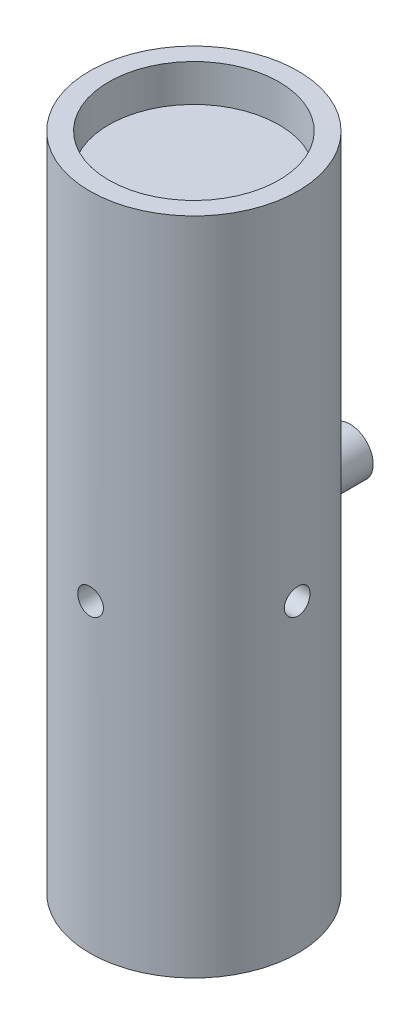
ISO-10303-21;
HEADER;
FILE_DESCRIPTION(('STEP AP214'),'2;1');
FILE_NAME('part.step','',(''),(''),'','','');
FILE_SCHEMA(('AUTOMOTIVE_DESIGN { 1 0 10303 214 1 1 1 1 }'));
ENDSEC;
DATA;
#1=APPLICATION_CONTEXT('core data for automotive mechanical design processes');
#2=APPLICATION_PROTOCOL_DEFINITION('international standard','automotive_design',2000,#1);
#3=PRODUCT_CONTEXT('',#1,'mechanical');
#4=PRODUCT('Part','Part','',(#3));
#5=PRODUCT_RELATED_PRODUCT_CATEGORY('part','',(#4));
#6=PRODUCT_DEFINITION_FORMATION('','',#4);
#7=PRODUCT_DEFINITION_CONTEXT('part definition',#1,'design');
#8=PRODUCT_DEFINITION('design','',#6,#7);
#9=PRODUCT_DEFINITION_SHAPE('','',#8);
#10=(LENGTH_UNIT() NAMED_UNIT(*) SI_UNIT(.MILLI.,.METRE.));
#11=(NAMED_UNIT(*) PLANE_ANGLE_UNIT() SI_UNIT($,.RADIAN.));
#12=(NAMED_UNIT(*) SI_UNIT($,.STERADIAN.) SOLID_ANGLE_UNIT());
#13=UNCERTAINTY_MEASURE_WITH_UNIT(LENGTH_MEASURE(1.E-05),#10,'distance_accuracy_value','');
#14=(GEOMETRIC_REPRESENTATION_CONTEXT(3) GLOBAL_UNCERTAINTY_ASSIGNED_CONTEXT((#13)) GLOBAL_UNIT_ASSIGNED_CONTEXT((#10,
#11,#12)) REPRESENTATION_CONTEXT('',''));
#15=CARTESIAN_POINT('',(0.,0.,0.));
#16=DIRECTION('',(0.,0.,1.));
#17=DIRECTION('',(1.,0.,0.));
#18=AXIS2_PLACEMENT_3D('',#15,#16,#17);
#19=CARTESIAN_POINT('',(0.,88.76,0.));
#20=DIRECTION('',(0.,-1.,0.));
#21=DIRECTION('',(0.,0.,-1.));
#22=AXIS2_PLACEMENT_3D('',#19,#20,#21);
#23=CYLINDRICAL_SURFACE('',#22,14.);
#24=CARTESIAN_POINT('',(0.,44.1186082579004,-14.));
#25=CARTESIAN_POINT('',(-0.17288559873218,44.1186024673412,-13.9999968247506));
#26=CARTESIAN_POINT('',(-0.345840479417576,44.1041834067007,-13.9967650947673));
#27=CARTESIAN_POINT('',(-0.686832100892802,44.0469512248152,-13.9841853435475));
#28=CARTESIAN_POINT('',(-0.854865330938911,44.00411832664,-13.9748330622746));
#29=CARTESIAN_POINT('',(-1.18103680616268,43.8914709054551,-13.9510528232426));
#30=CARTESIAN_POINT('',(-1.33918537166739,43.8216850891238,-13.9366302671309));
#31=CARTESIAN_POINT('',(-1.64152455498517,43.6572051450233,-13.9042635463428));
#32=CARTESIAN_POINT('',(-1.78571542977247,43.5625114759505,-13.8863194465198));
#33=CARTESIAN_POINT('',(-2.05844551454854,43.3492400436006,-13.8485400545193));
#34=CARTESIAN_POINT('',(-2.1867197668435,43.2303277089666,-13.8286805852968));
#35=CARTESIAN_POINT('',(-2.42167726702624,42.9727124578508,-13.7894778760588));
#36=CARTESIAN_POINT('',(-2.52835853214359,42.8340077259292,-13.7701346835918));
#37=CARTESIAN_POINT('',(-2.71828012896653,42.5387739892548,-13.7339156497362));
#38=CARTESIAN_POINT('',(-2.80123665011034,42.3820582749069,-13.7170707557811));
#39=CARTESIAN_POINT('',(-2.93953287428987,42.0564730730984,-13.6881033051187));
#40=CARTESIAN_POINT('',(-2.99487601179261,41.887605100089,-13.6759801611759));
#41=CARTESIAN_POINT('',(-3.07549535815312,41.5453880859891,-13.6580753617231));
#42=CARTESIAN_POINT('',(-3.10124159821529,41.3721550672849,-13.6521946877488));
#43=CARTESIAN_POINT('',(-3.12339813959293,41.0237363338195,-13.6471434018822));
#44=CARTESIAN_POINT('',(-3.11981218597547,40.848550871194,-13.6479719333736));
#45=CARTESIAN_POINT('',(-3.08378398910555,40.504707314814,-13.6561558737748));
#46=CARTESIAN_POINT('',(-3.05188944617238,40.3359884353907,-13.6633873945013));
#47=CARTESIAN_POINT('',(-2.96101789019469,40.0063580333015,-13.6833664424506));
#48=CARTESIAN_POINT('',(-2.90203930713653,39.8454469638384,-13.6961142894426));
#49=CARTESIAN_POINT('',(-2.75817542249511,39.5344688561734,-13.725810681509));
#50=CARTESIAN_POINT('',(-2.67308097729531,39.3845019233446,-13.7427929230549));
#51=CARTESIAN_POINT('',(-2.4795478405837,39.1007738865381,-13.7790241730297));
#52=CARTESIAN_POINT('',(-2.37110585516413,38.967015073393,-13.7982735011289));
#53=CARTESIAN_POINT('',(-2.13106422598798,38.7163486135509,-13.8374003707265));
#54=CARTESIAN_POINT('',(-1.99899926662553,38.599886791815,-13.8572823128574));
#55=CARTESIAN_POINT('',(-1.71698599477565,38.3906897481412,-13.8950410771421));
#56=CARTESIAN_POINT('',(-1.5670373346138,38.297954987588,-13.9129178603008));
#57=CARTESIAN_POINT('',(-1.2529578336961,38.1387279041848,-13.9447135400002));
#58=CARTESIAN_POINT('',(-1.08879553766422,38.0722956974523,-13.9586233497307));
#59=CARTESIAN_POINT('',(-0.751258802252493,37.9680843570755,-13.9808505186551));
#60=CARTESIAN_POINT('',(-0.577885757694159,37.9303008981934,-13.9891687220189));
#61=CARTESIAN_POINT('',(-0.230671562074419,37.8851119665634,-13.9991547012776));
#62=CARTESIAN_POINT('',(-0.0569133651427911,37.8770977319561,-14.0009557292084));
#63=CARTESIAN_POINT('',(0.289459185599277,37.8900223312151,-13.9980785834611));
#64=CARTESIAN_POINT('',(0.462073619172824,37.9109591242973,-13.9934008664756));
#65=CARTESIAN_POINT('',(0.799229731055024,37.9806869676355,-13.978176083199));
#66=CARTESIAN_POINT('',(0.963841093922699,38.0291571544068,-13.9676966628098));
#67=CARTESIAN_POINT('',(1.28259619913986,38.1522184931753,-13.9420421302591));
#68=CARTESIAN_POINT('',(1.4367390258074,38.2268119266663,-13.9268666079734));
#69=CARTESIAN_POINT('',(1.73268724707733,38.4012598069373,-13.893175494117));
#70=CARTESIAN_POINT('',(1.87427769086642,38.5014698570404,-13.8746140344689));
#71=CARTESIAN_POINT('',(2.13885105141606,38.7238398320689,-13.836300741361));
#72=CARTESIAN_POINT('',(2.26183145112206,38.8460027212911,-13.8165487473829));
#73=CARTESIAN_POINT('',(2.48811324521392,39.1116086297432,-13.777617869484));
#74=CARTESIAN_POINT('',(2.59099235322009,39.255414590721,-13.7584572223187));
#75=CARTESIAN_POINT('',(2.77114279726259,39.558619858086,-13.7233095812992));
#76=CARTESIAN_POINT('',(2.84841525384738,39.7180184817421,-13.7073224485841));
#77=CARTESIAN_POINT('',(2.97462785829789,40.0470229324819,-13.6804881379722));
#78=CARTESIAN_POINT('',(3.02372934654999,40.216564365883,-13.669611756132));
#79=CARTESIAN_POINT('',(3.09267431116263,40.5617662170522,-13.6541801894995));
#80=CARTESIAN_POINT('',(3.11252266743898,40.7374256092358,-13.6496239504083));
#81=CARTESIAN_POINT('',(3.12218428843875,41.0856148199428,-13.6474167219632));
#82=CARTESIAN_POINT('',(3.11266769128317,41.2581254017889,-13.6496116601893));
#83=CARTESIAN_POINT('',(3.06537202884534,41.5990181576787,-13.6603100772083));
#84=CARTESIAN_POINT('',(3.02759332261919,41.767400384143,-13.6688134758552));
#85=CARTESIAN_POINT('',(2.92517500962827,42.0947004213257,-13.6910942253496));
#86=CARTESIAN_POINT('',(2.86063638217311,42.2536512710079,-13.7048517344222));
#87=CARTESIAN_POINT('',(2.70661573281935,42.5585673824521,-13.7360976644981));
#88=CARTESIAN_POINT('',(2.61713100167286,42.7045312315007,-13.753586490689));
#89=CARTESIAN_POINT('',(2.41355049808499,42.982625699621,-13.7907822079222));
#90=CARTESIAN_POINT('',(2.29897863448145,43.114402673395,-13.8105278747951));
#91=CARTESIAN_POINT('',(2.04943657846777,43.3570797432469,-13.8497556581205));
#92=CARTESIAN_POINT('',(1.91446166642579,43.4679749956029,-13.8692377124553));
#93=CARTESIAN_POINT('',(1.62573764660428,43.6671846244696,-13.9060569221095));
#94=CARTESIAN_POINT('',(1.47175869527225,43.7551722717375,-13.9233613955426));
#95=CARTESIAN_POINT('',(1.15084119254359,43.9038770975076,-13.9535460728217));
#96=CARTESIAN_POINT('',(0.983913455188289,43.9646167503259,-13.966429920757));
#97=CARTESIAN_POINT('',(0.680725554332899,44.04649289364,-13.984070036509));
#98=CARTESIAN_POINT('',(0.546084206629924,44.0734837563576,-13.9900062946732));
#99=CARTESIAN_POINT('',(0.274309699400431,44.1095433100654,-13.9979724433399));
#100=CARTESIAN_POINT('',(0.137176658558493,44.118612852439,-14.0000025194123));
#101=CARTESIAN_POINT('',(0.,44.1186082579004,-14.));
#102=B_SPLINE_CURVE_WITH_KNOTS('',3,(#24,#25,#26,#27,#28,#29,#30,#31,#32,#33,#34,#35,#36,#37,
#38,#39,#40,#41,#42,#43,#44,#45,#46,#47,#48,#49,#50,#51,#52,#53,#54,#55,#56,#57,#58,#59,#60,#61,
#62,#63,#64,#65,#66,#67,#68,#69,#70,#71,#72,#73,#74,#75,#76,#77,#78,#79,#80,#81,#82,#83,#84,#85,
#86,#87,#88,#89,#90,#91,#92,#93,#94,#95,#96,#97,#98,#99,#100,#101),.UNSPECIFIED.,.T.,.F.,(4,2,2,
2,2,2,2,2,2,2,2,2,2,2,2,2,2,2,2,2,2,2,2,2,2,2,2,2,2,2,2,2,2,2,2,2,2,2,4),(0.,0.51815460608699,
1.03667024312229,1.55463514216143,2.07259050316424,2.5982565456218,3.12397083535044,
3.65573350360209,4.18743001636538,4.7105605918032,5.23362437617416,5.74678357273975,
6.25997251998707,6.77738349167562,7.29486750840876,7.82397133919104,8.35308545788052,
8.88340201364187,9.41363848903806,9.93297032155987,10.4522655477808,10.9656297376404,
11.4790387737414,12.0000034990196,12.5210386232103,13.0520586995312,13.5830555353152,
14.1109800899864,14.6388165679659,15.1546970795877,15.6705710373145,16.1845157954329,
16.698516391793,17.2232795088751,17.7481642004129,18.2801692381619,18.8117346643927,
19.2228857085543,19.6340172198019),.UNSPECIFIED.);
#103=CARTESIAN_POINT('',(0.,44.1186082579004,-14.));
#104=VERTEX_POINT('',#103);
#105=EDGE_CURVE('E36',#104,#104,#102,.T.);
#106=ORIENTED_EDGE('',*,*,#105,.T.);
#107=EDGE_LOOP('',(#106));
#108=FACE_BOUND('',#107,.T.);
#109=CARTESIAN_POINT('',(13.8930479074967,41.,-1.7272000000001));
#110=CARTESIAN_POINT('',(13.893049279539,40.9033793370709,-1.72719588604162));
#111=CARTESIAN_POINT('',(13.8940667272773,40.8066980343089,-1.71906511453124));
#112=CARTESIAN_POINT('',(13.8980251148983,40.6160253568237,-1.686758002871));
#113=CARTESIAN_POINT('',(13.9009680725972,40.5220369120187,-1.66256482991785));
#114=CARTESIAN_POINT('',(13.9084391810615,40.3395382287311,-1.59885636466381));
#115=CARTESIAN_POINT('',(13.91296626401,40.2510243471675,-1.55935139171637));
#116=CARTESIAN_POINT('',(13.9230942463574,40.0818991424104,-1.46616265848701));
#117=CARTESIAN_POINT('',(13.9286949600154,40.0012864559311,-1.4124813501402));
#118=CARTESIAN_POINT('',(13.9403733632056,39.8497954915744,-1.29215000714462));
#119=CARTESIAN_POINT('',(13.9464532432796,39.7789665446242,-1.22543807319452));
#120=CARTESIAN_POINT('',(13.9583852180611,39.6494796629288,-1.08107237607794));
#121=CARTESIAN_POINT('',(13.9642373014919,39.5908223300996,-1.0034180721032));
#122=CARTESIAN_POINT('',(13.9750766794692,39.4871672015963,-0.839062396188953));
#123=CARTESIAN_POINT('',(13.980061129278,39.4422139891164,-0.752332703137645));
#124=CARTESIAN_POINT('',(13.9885795670719,39.3675286922694,-0.572483359979207));
#125=CARTESIAN_POINT('',(13.9921136075552,39.3377960569773,-0.479363941293374));
#126=CARTESIAN_POINT('',(13.9973176119755,39.2945431346774,-0.289882629950009));
#127=CARTESIAN_POINT('',(13.9989969964289,39.2809408888995,-0.193539708895858));
#128=CARTESIAN_POINT('',(14.0003346278483,39.2700808905151,7.49989874680111E-05));
#129=CARTESIAN_POINT('',(13.9999929523827,39.2728225106311,0.0973467500250934));
#130=CARTESIAN_POINT('',(13.9973345900229,39.2945066757744,0.289500397578608));
#131=CARTESIAN_POINT('',(13.9950286486995,39.3133610772016,0.384392410490887));
#132=CARTESIAN_POINT('',(13.9887129417367,39.3665978448888,0.569655073134819));
#133=CARTESIAN_POINT('',(13.9847031444169,39.4009804998704,0.660025638763097));
#134=CARTESIAN_POINT('',(13.9754117852552,39.4843917199307,0.833953349207581));
#135=CARTESIAN_POINT('',(13.970126912854,39.5334584913777,0.917491987206828));
#136=CARTESIAN_POINT('',(13.9588767927999,39.6448173289813,1.07518260090524));
#137=CARTESIAN_POINT('',(13.952911514754,39.7071099860312,1.14933415698117));
#138=CARTESIAN_POINT('',(13.9409214245423,39.8436461588597,1.28666344244609));
#139=CARTESIAN_POINT('',(13.9348964804332,39.9179664822576,1.34976482085162));
#140=CARTESIAN_POINT('',(13.9235053368697,40.0761842795777,1.46260929966532));
#141=CARTESIAN_POINT('',(13.9181391393849,40.1600817821353,1.51235236013108));
#142=CARTESIAN_POINT('',(13.9086730901606,40.3351397585469,1.59707220873278));
#143=CARTESIAN_POINT('',(13.9045737545441,40.4263031735783,1.63204298071987));
#144=CARTESIAN_POINT('',(13.8981156799109,40.6132702895199,1.68615837352453));
#145=CARTESIAN_POINT('',(13.8957568592551,40.7090737725626,1.70530373663956));
#146=CARTESIAN_POINT('',(13.8930617597236,40.9019274786481,1.72712393760463));
#147=CARTESIAN_POINT('',(13.8927122922309,40.9989653723227,1.72990617942028));
#148=CARTESIAN_POINT('',(13.8940405922181,41.1921241408616,1.71920445347668));
#149=CARTESIAN_POINT('',(13.8957183176347,41.2882450347116,1.70572082322641));
#150=CARTESIAN_POINT('',(13.9008999338901,41.4765200495522,1.66296049468531));
#151=CARTESIAN_POINT('',(13.9043978199638,41.568686141808,1.63373571585994));
#152=CARTESIAN_POINT('',(13.9128207648452,41.7468096368925,1.56037608811249));
#153=CARTESIAN_POINT('',(13.9177458725644,41.8327668268134,1.51624072819001));
#154=CARTESIAN_POINT('',(13.9284999406754,41.9965186975951,1.41404834903007));
#155=CARTESIAN_POINT('',(13.9343334227513,42.0742690885775,1.35592084378225));
#156=CARTESIAN_POINT('',(13.9462327131808,42.2189486104121,1.22749394000495));
#157=CARTESIAN_POINT('',(13.9522985303261,42.2858773312658,1.15719408051275));
#158=CARTESIAN_POINT('',(13.9640194889653,42.4073904500242,1.005949072118));
#159=CARTESIAN_POINT('',(13.9696721655981,42.4619043090757,0.924947032682402));
#160=CARTESIAN_POINT('',(13.9798931499845,42.5565523638888,0.754873991551687));
#161=CARTESIAN_POINT('',(13.9844614791089,42.5966868430561,0.665803148929425));
#162=CARTESIAN_POINT('',(13.9919880872814,42.6613201662061,0.48235614105443));
#163=CARTESIAN_POINT('',(13.9949505747122,42.6858599082761,0.387994565099221));
#164=CARTESIAN_POINT('',(13.998949168256,42.7187402412974,0.196451481687264));
#165=CARTESIAN_POINT('',(13.9999853588751,42.7270815428703,0.0992700981246359));
#166=CARTESIAN_POINT('',(14.0000142359309,42.7273151742337,-0.0944649278808875));
#167=CARTESIAN_POINT('',(13.9990204414093,42.7193163241005,-0.191018455188328));
#168=CARTESIAN_POINT('',(13.9951278672467,42.6873270218687,-0.381397890983759));
#169=CARTESIAN_POINT('',(13.9922290886942,42.6633365789069,-0.475223801030129));
#170=CARTESIAN_POINT('',(13.9848508478043,42.6000789842452,-0.657471313639399));
#171=CARTESIAN_POINT('',(13.9803719101848,42.5608169033005,-0.745894698778312));
#172=CARTESIAN_POINT('',(13.9703295400317,42.4681418146364,-0.914914876413798));
#173=CARTESIAN_POINT('',(13.96476609596,42.4147286563607,-0.99551158562832));
#174=CARTESIAN_POINT('',(13.9531316739966,42.2948645368479,-1.14714668568273));
#175=CARTESIAN_POINT('',(13.9470576850453,42.2283325841316,-1.21812082713629));
#176=CARTESIAN_POINT('',(13.935111016308,42.0842873250666,-1.3479400676129));
#177=CARTESIAN_POINT('',(13.9292383845853,42.0067714192418,-1.40678228736407));
#178=CARTESIAN_POINT('',(13.9183357881812,41.8426248928451,-1.51085593521371));
#179=CARTESIAN_POINT('',(13.913309077807,41.7559610693787,-1.55603530962136));
#180=CARTESIAN_POINT('',(13.9047056401041,41.5762634577672,-1.63113541101772));
#181=CARTESIAN_POINT('',(13.9011273324113,41.4832367425365,-1.6610727779356));
#182=CARTESIAN_POINT('',(13.8966971119924,41.3247709864979,-1.69765025910164));
#183=CARTESIAN_POINT('',(13.8953354507104,41.2603325415453,-1.70871553410945));
#184=CARTESIAN_POINT('',(13.8935103879911,41.1306052974935,-1.72349176819766));
#185=CARTESIAN_POINT('',(13.8930469799829,41.0653165046182,-1.7272027810759));
#186=CARTESIAN_POINT('',(13.8930479074967,41.,-1.7272000000001));
#187=B_SPLINE_CURVE_WITH_KNOTS('',3,(#109,#110,#111,#112,#113,#114,#115,#116,#117,#118,#119,
#120,#121,#122,#123,#124,#125,#126,#127,#128,#129,#130,#131,#132,#133,#134,#135,#136,#137,#138,
#139,#140,#141,#142,#143,#144,#145,#146,#147,#148,#149,#150,#151,#152,#153,#154,#155,#156,#157,
#158,#159,#160,#161,#162,#163,#164,#165,#166,#167,#168,#169,#170,#171,#172,#173,#174,#175,#176,
#177,#178,#179,#180,#181,#182,#183,#184,#185,#186),.UNSPECIFIED.,.T.,.F.,(4,2,2,2,2,2,2,2,2,2,2,
2,2,2,2,2,2,2,2,2,2,2,2,2,2,2,2,2,2,2,2,2,2,2,2,2,2,2,4),(0.,0.289623383011135,0.57955076072069,
0.869283081327482,1.15896532269422,1.4500586600865,1.74116638932741,2.03321130507155,
2.32524564919165,2.61578971612077,2.9063226320417,3.19527631203956,3.48423536486391,
3.7739528907013,4.06368336298014,4.35534286519352,4.64700323948198,4.93878228085865,
5.23054763544001,5.52039574944605,5.81023784934708,6.09912975736368,6.38803156699711,
6.67842036382456,6.96882015997846,7.26083092695569,7.55283593832311,7.84407195472675,
8.13529519438815,8.42458530586638,8.71387525206021,9.00306922505241,9.29226627496115,
9.58330803803057,9.87441879480288,10.1666250648641,10.4585116411966,10.6543012874776,
10.8500895015148),.UNSPECIFIED.);
#188=CARTESIAN_POINT('',(13.8930479074967,41.,-1.7272000000001));
#189=VERTEX_POINT('',#188);
#190=EDGE_CURVE('E11',#189,#189,#187,.T.);
#191=ORIENTED_EDGE('',*,*,#190,.T.);
#192=EDGE_LOOP('',(#191));
#193=FACE_BOUND('',#192,.T.);
#194=CARTESIAN_POINT('',(1.72720000000005,41.,13.8930479074967));
#195=CARTESIAN_POINT('',(1.72719588604158,40.9033793370709,13.893049279539));
#196=CARTESIAN_POINT('',(1.71906511453119,40.8066980343089,13.8940667272773));
#197=CARTESIAN_POINT('',(1.68675800287096,40.6160253568237,13.8980251148983));
#198=CARTESIAN_POINT('',(1.66256482991781,40.5220369120187,13.9009680725972));
#199=CARTESIAN_POINT('',(1.59885636466376,40.3395382287311,13.9084391810615));
#200=CARTESIAN_POINT('',(1.55935139171632,40.2510243471675,13.91296626401));
#201=CARTESIAN_POINT('',(1.46616265848696,40.0818991424104,13.9230942463574));
#202=CARTESIAN_POINT('',(1.41248135014016,40.0012864559311,13.9286949600154));
#203=CARTESIAN_POINT('',(1.29215000714457,39.8497954915744,13.9403733632056));
#204=CARTESIAN_POINT('',(1.22543807319447,39.7789665446242,13.9464532432796));
#205=CARTESIAN_POINT('',(1.08107237607789,39.6494796629288,13.9583852180611));
#206=CARTESIAN_POINT('',(1.00341807210315,39.5908223300996,13.9642373014919));
#207=CARTESIAN_POINT('',(0.839062396188906,39.4871672015963,13.9750766794692));
#208=CARTESIAN_POINT('',(0.752332703137597,39.4422139891164,13.980061129278));
#209=CARTESIAN_POINT('',(0.572483359979159,39.3675286922694,13.9885795670719));
#210=CARTESIAN_POINT('',(0.479363941293326,39.3377960569773,13.9921136075552));
#211=CARTESIAN_POINT('',(0.289882629949961,39.2945431346774,13.9973176119755));
#212=CARTESIAN_POINT('',(0.193539708895809,39.2809408888995,13.9989969964289));
#213=CARTESIAN_POINT('',(-7.49989875164885E-05,39.2700808905151,14.0003346278483));
#214=CARTESIAN_POINT('',(-0.0973467500251418,39.2728225106311,13.9999929523827));
#215=CARTESIAN_POINT('',(-0.289500397578657,39.2945066757744,13.9973345900229));
#216=CARTESIAN_POINT('',(-0.384392410490936,39.3133610772016,13.9950286486995));
#217=CARTESIAN_POINT('',(-0.569655073134868,39.3665978448888,13.9887129417367));
#218=CARTESIAN_POINT('',(-0.660025638763146,39.4009804998704,13.9847031444169));
#219=CARTESIAN_POINT('',(-0.833953349207632,39.4843917199307,13.9754117852552));
#220=CARTESIAN_POINT('',(-0.917491987206882,39.5334584913777,13.970126912854));
#221=CARTESIAN_POINT('',(-1.07518260090529,39.6448173289813,13.9588767927999));
#222=CARTESIAN_POINT('',(-1.14933415698122,39.7071099860312,13.952911514754));
#223=CARTESIAN_POINT('',(-1.28666344244614,39.8436461588597,13.9409214245423));
#224=CARTESIAN_POINT('',(-1.34976482085167,39.9179664822576,13.9348964804332));
#225=CARTESIAN_POINT('',(-1.46260929966537,40.0761842795777,13.9235053368697));
#226=CARTESIAN_POINT('',(-1.51235236013113,40.1600817821353,13.9181391393849));
#227=CARTESIAN_POINT('',(-1.59707220873283,40.3351397585469,13.9086730901606));
#228=CARTESIAN_POINT('',(-1.63204298071991,40.4263031735783,13.9045737545441));
#229=CARTESIAN_POINT('',(-1.68615837352458,40.6132702895199,13.8981156799109));
#230=CARTESIAN_POINT('',(-1.70530373663961,40.7090737725626,13.8957568592551));
#231=CARTESIAN_POINT('',(-1.72712393760468,40.9019274786481,13.8930617597236));
#232=CARTESIAN_POINT('',(-1.72990617942033,40.9989653723227,13.8927122922309));
#233=CARTESIAN_POINT('',(-1.71920445347673,41.1921241408616,13.8940405922181));
#234=CARTESIAN_POINT('',(-1.70572082322646,41.2882450347116,13.8957183176347));
#235=CARTESIAN_POINT('',(-1.66296049468537,41.4765200495522,13.9008999338901));
#236=CARTESIAN_POINT('',(-1.63373571585999,41.568686141808,13.9043978199637));
#237=CARTESIAN_POINT('',(-1.56037608811254,41.7468096368925,13.9128207648451));
#238=CARTESIAN_POINT('',(-1.51624072819006,41.8327668268134,13.9177458725643));
#239=CARTESIAN_POINT('',(-1.41404834903012,41.9965186975951,13.9284999406754));
#240=CARTESIAN_POINT('',(-1.3559208437823,42.0742690885775,13.9343334227513));
#241=CARTESIAN_POINT('',(-1.227493940005,42.2189486104121,13.9462327131808));
#242=CARTESIAN_POINT('',(-1.1571940805128,42.2858773312658,13.9522985303261));
#243=CARTESIAN_POINT('',(-1.00594907211805,42.4073904500242,13.9640194889652));
#244=CARTESIAN_POINT('',(-0.924947032682454,42.4619043090757,13.9696721655981));
#245=CARTESIAN_POINT('',(-0.75487399155174,42.5565523638888,13.9798931499845));
#246=CARTESIAN_POINT('',(-0.665803148929476,42.5966868430561,13.9844614791089));
#247=CARTESIAN_POINT('',(-0.482356141054481,42.6613201662061,13.9919880872814));
#248=CARTESIAN_POINT('',(-0.387994565099271,42.6858599082761,13.9949505747122));
#249=CARTESIAN_POINT('',(-0.196451481687314,42.7187402412974,13.998949168256));
#250=CARTESIAN_POINT('',(-0.0992700981246864,42.7270815428703,13.9999853588751));
#251=CARTESIAN_POINT('',(0.0944649278808368,42.7273151742337,14.0000142359309));
#252=CARTESIAN_POINT('',(0.191018455188277,42.7193163241005,13.9990204414093));
#253=CARTESIAN_POINT('',(0.381397890983708,42.6873270218687,13.9951278672467));
#254=CARTESIAN_POINT('',(0.475223801030079,42.6633365789069,13.9922290886942));
#255=CARTESIAN_POINT('',(0.657471313639349,42.6000789842452,13.9848508478043));
#256=CARTESIAN_POINT('',(0.745894698778263,42.5608169033005,13.9803719101848));
#257=CARTESIAN_POINT('',(0.914914876413749,42.4681418146364,13.9703295400317));
#258=CARTESIAN_POINT('',(0.995511585628271,42.4147286563607,13.96476609596));
#259=CARTESIAN_POINT('',(1.14714668568268,42.2948645368479,13.9531316739966));
#260=CARTESIAN_POINT('',(1.21812082713624,42.2283325841316,13.9470576850453));
#261=CARTESIAN_POINT('',(1.34794006761285,42.0842873250666,13.935111016308));
#262=CARTESIAN_POINT('',(1.40678228736402,42.0067714192418,13.9292383845853));
#263=CARTESIAN_POINT('',(1.51085593521366,41.8426248928451,13.9183357881813));
#264=CARTESIAN_POINT('',(1.55603530962131,41.7559610693787,13.913309077807));
#265=CARTESIAN_POINT('',(1.63113541101767,41.5762634577672,13.9047056401041));
#266=CARTESIAN_POINT('',(1.66107277793555,41.4832367425365,13.9011273324113));
#267=CARTESIAN_POINT('',(1.6976502591016,41.3247709864979,13.8966971119924));
#268=CARTESIAN_POINT('',(1.7087155341094,41.2603325415453,13.8953354507105));
#269=CARTESIAN_POINT('',(1.72349176819761,41.1306052974935,13.8935103879911));
#270=CARTESIAN_POINT('',(1.72720278107585,41.0653165046182,13.8930469799829));
#271=CARTESIAN_POINT('',(1.72720000000005,41.,13.8930479074967));
#272=B_SPLINE_CURVE_WITH_KNOTS('',3,(#194,#195,#196,#197,#198,#199,#200,#201,#202,#203,#204,
#205,#206,#207,#208,#209,#210,#211,#212,#213,#214,#215,#216,#217,#218,#219,#220,#221,#222,#223,
#224,#225,#226,#227,#228,#229,#230,#231,#232,#233,#234,#235,#236,#237,#238,#239,#240,#241,#242,
#243,#244,#245,#246,#247,#248,#249,#250,#251,#252,#253,#254,#255,#256,#257,#258,#259,#260,#261,
#262,#263,#264,#265,#266,#267,#268,#269,#270,#271),.UNSPECIFIED.,.T.,.F.,(4,2,2,2,2,2,2,2,2,2,2,
2,2,2,2,2,2,2,2,2,2,2,2,2,2,2,2,2,2,2,2,2,2,2,2,2,2,2,4),(0.,0.289623383011136,0.57955076072069,
0.869283081327482,1.15896532269422,1.4500586600865,1.74116638932741,2.03321130507155,
2.32524564919165,2.61578971612077,2.9063226320417,3.19527631203956,3.48423536486391,
3.77395289070131,4.06368336298014,4.35534286519352,4.64700323948198,4.93878228085865,
5.23054763544001,5.52039574944604,5.81023784934708,6.09912975736367,6.38803156699711,
6.67842036382456,6.96882015997846,7.26083092695569,7.55283593832311,7.84407195472675,
8.13529519438814,8.42458530586638,8.71387525206021,9.00306922505241,9.29226627496115,
9.58330803803056,9.87441879480288,10.1666250648641,10.4585116411966,10.6543012874776,
10.8500895015148),.UNSPECIFIED.);
#273=CARTESIAN_POINT('',(1.72720000000005,41.,13.8930479074967));
#274=VERTEX_POINT('',#273);
#275=EDGE_CURVE('E44',#274,#274,#272,.T.);
#276=ORIENTED_EDGE('',*,*,#275,.T.);
#277=EDGE_LOOP('',(#276));
#278=FACE_BOUND('',#277,.T.);
#279=CARTESIAN_POINT('',(-13.8930479074968,41.,1.7272));
#280=CARTESIAN_POINT('',(-13.893049279539,40.9033793370709,1.72719588604153));
#281=CARTESIAN_POINT('',(-13.8940667272773,40.8066980343089,1.71906511453114));
#282=CARTESIAN_POINT('',(-13.8980251148983,40.6160253568237,1.68675800287091));
#283=CARTESIAN_POINT('',(-13.9009680725972,40.5220369120187,1.66256482991776));
#284=CARTESIAN_POINT('',(-13.9084391810615,40.3395382287311,1.59885636466371));
#285=CARTESIAN_POINT('',(-13.91296626401,40.2510243471675,1.55935139171627));
#286=CARTESIAN_POINT('',(-13.9230942463574,40.0818991424104,1.46616265848691));
#287=CARTESIAN_POINT('',(-13.9286949600154,40.0012864559311,1.41248135014011));
#288=CARTESIAN_POINT('',(-13.9403733632056,39.8497954915744,1.29215000714452));
#289=CARTESIAN_POINT('',(-13.9464532432796,39.7789665446242,1.22543807319442));
#290=CARTESIAN_POINT('',(-13.9583852180611,39.6494796629288,1.08107237607784));
#291=CARTESIAN_POINT('',(-13.9642373014919,39.5908223300996,1.0034180721031));
#292=CARTESIAN_POINT('',(-13.9750766794692,39.4871672015963,0.839062396188856));
#293=CARTESIAN_POINT('',(-13.980061129278,39.4422139891164,0.752332703137548));
#294=CARTESIAN_POINT('',(-13.9885795670719,39.3675286922694,0.572483359979109));
#295=CARTESIAN_POINT('',(-13.9921136075552,39.3377960569773,0.479363941293276));
#296=CARTESIAN_POINT('',(-13.9973176119755,39.2945431346774,0.289882629949911));
#297=CARTESIAN_POINT('',(-13.9989969964289,39.2809408888995,0.193539708895759));
#298=CARTESIAN_POINT('',(-14.0003346278483,39.2700808905151,-7.499898756605E-05));
#299=CARTESIAN_POINT('',(-13.9999929523827,39.2728225106311,-0.0973467500251913));
#300=CARTESIAN_POINT('',(-13.9973345900229,39.2945066757744,-0.289500397578707));
#301=CARTESIAN_POINT('',(-13.9950286486995,39.3133610772016,-0.384392410490985));
#302=CARTESIAN_POINT('',(-13.9887129417367,39.3665978448888,-0.569655073134917));
#303=CARTESIAN_POINT('',(-13.9847031444169,39.4009804998704,-0.660025638763195));
#304=CARTESIAN_POINT('',(-13.9754117852552,39.4843917199307,-0.833953349207678));
#305=CARTESIAN_POINT('',(-13.970126912854,39.5334584913777,-0.917491987206926));
#306=CARTESIAN_POINT('',(-13.9588767927999,39.6448173289813,-1.07518260090534));
#307=CARTESIAN_POINT('',(-13.952911514754,39.7071099860312,-1.14933415698127));
#308=CARTESIAN_POINT('',(-13.9409214245423,39.8436461588597,-1.28666344244619));
#309=CARTESIAN_POINT('',(-13.9348964804332,39.9179664822576,-1.34976482085172));
#310=CARTESIAN_POINT('',(-13.9235053368697,40.0761842795777,-1.46260929966542));
#311=CARTESIAN_POINT('',(-13.9181391393849,40.1600817821353,-1.51235236013118));
#312=CARTESIAN_POINT('',(-13.9086730901606,40.3351397585469,-1.59707220873287));
#313=CARTESIAN_POINT('',(-13.9045737545441,40.4263031735783,-1.63204298071996));
#314=CARTESIAN_POINT('',(-13.8981156799109,40.6132702895199,-1.68615837352463));
#315=CARTESIAN_POINT('',(-13.8957568592551,40.7090737725626,-1.70530373663965));
#316=CARTESIAN_POINT('',(-13.8930617597236,40.9019274786481,-1.72712393760473));
#317=CARTESIAN_POINT('',(-13.8927122922309,40.9989653723227,-1.72990617942038));
#318=CARTESIAN_POINT('',(-13.8940405922181,41.1921241408616,-1.71920445347677));
#319=CARTESIAN_POINT('',(-13.8957183176347,41.2882450347116,-1.70572082322651));
#320=CARTESIAN_POINT('',(-13.9008999338901,41.4765200495522,-1.66296049468541));
#321=CARTESIAN_POINT('',(-13.9043978199637,41.568686141808,-1.63373571586003));
#322=CARTESIAN_POINT('',(-13.9128207648451,41.7468096368925,-1.56037608811258));
#323=CARTESIAN_POINT('',(-13.9177458725643,41.8327668268134,-1.5162407281901));
#324=CARTESIAN_POINT('',(-13.9284999406754,41.9965186975951,-1.41404834903017));
#325=CARTESIAN_POINT('',(-13.9343334227513,42.0742690885775,-1.35592084378235));
#326=CARTESIAN_POINT('',(-13.9462327131808,42.2189486104121,-1.22749394000505));
#327=CARTESIAN_POINT('',(-13.9522985303261,42.2858773312658,-1.15719408051285));
#328=CARTESIAN_POINT('',(-13.9640194889652,42.4073904500242,-1.00594907211809));
#329=CARTESIAN_POINT('',(-13.9696721655981,42.4619043090757,-0.9249470326825));
#330=CARTESIAN_POINT('',(-13.9798931499845,42.5565523638888,-0.754873991551785));
#331=CARTESIAN_POINT('',(-13.9844614791089,42.5966868430561,-0.665803148929523));
#332=CARTESIAN_POINT('',(-13.9919880872814,42.6613201662061,-0.482356141054528));
#333=CARTESIAN_POINT('',(-13.9949505747122,42.6858599082761,-0.387994565099318));
#334=CARTESIAN_POINT('',(-13.998949168256,42.7187402412974,-0.196451481687361));
#335=CARTESIAN_POINT('',(-13.9999853588751,42.7270815428703,-0.0992700981247334));
#336=CARTESIAN_POINT('',(-14.0000142359309,42.7273151742337,0.0944649278807885));
#337=CARTESIAN_POINT('',(-13.9990204414093,42.7193163241005,0.191018455188228));
#338=CARTESIAN_POINT('',(-13.9951278672467,42.6873270218687,0.381397890983659));
#339=CARTESIAN_POINT('',(-13.9922290886942,42.6633365789069,0.47522380103003));
#340=CARTESIAN_POINT('',(-13.9848508478043,42.6000789842452,0.657471313639301));
#341=CARTESIAN_POINT('',(-13.9803719101848,42.5608169033005,0.745894698778214));
#342=CARTESIAN_POINT('',(-13.9703295400317,42.4681418146364,0.9149148764137));
#343=CARTESIAN_POINT('',(-13.96476609596,42.4147286563607,0.995511585628223));
#344=CARTESIAN_POINT('',(-13.9531316739966,42.2948645368479,1.14714668568263));
#345=CARTESIAN_POINT('',(-13.9470576850453,42.2283325841316,1.21812082713619));
#346=CARTESIAN_POINT('',(-13.935111016308,42.0842873250666,1.3479400676128));
#347=CARTESIAN_POINT('',(-13.9292383845853,42.0067714192418,1.40678228736397));
#348=CARTESIAN_POINT('',(-13.9183357881813,41.8426248928451,1.51085593521361));
#349=CARTESIAN_POINT('',(-13.913309077807,41.7559610693787,1.55603530962127));
#350=CARTESIAN_POINT('',(-13.9047056401041,41.5762634577672,1.63113541101762));
#351=CARTESIAN_POINT('',(-13.9011273324113,41.4832367425365,1.6610727779355));
#352=CARTESIAN_POINT('',(-13.8966971119924,41.3247709864979,1.69765025910155));
#353=CARTESIAN_POINT('',(-13.8953354507105,41.2603325415453,1.70871553410935));
#354=CARTESIAN_POINT('',(-13.8935103879912,41.1306052974935,1.72349176819757));
#355=CARTESIAN_POINT('',(-13.8930469799829,41.0653165046182,1.7272027810758));
#356=CARTESIAN_POINT('',(-13.8930479074968,41.,1.7272));
#357=B_SPLINE_CURVE_WITH_KNOTS('',3,(#279,#280,#281,#282,#283,#284,#285,#286,#287,#288,#289,
#290,#291,#292,#293,#294,#295,#296,#297,#298,#299,#300,#301,#302,#303,#304,#305,#306,#307,#308,
#309,#310,#311,#312,#313,#314,#315,#316,#317,#318,#319,#320,#321,#322,#323,#324,#325,#326,#327,
#328,#329,#330,#331,#332,#333,#334,#335,#336,#337,#338,#339,#340,#341,#342,#343,#344,#345,#346,
#347,#348,#349,#350,#351,#352,#353,#354,#355,#356),.UNSPECIFIED.,.T.,.F.,(4,2,2,2,2,2,2,2,2,2,2,
2,2,2,2,2,2,2,2,2,2,2,2,2,2,2,2,2,2,2,2,2,2,2,2,2,2,2,4),(0.,0.289623383011135,0.57955076072069,
0.869283081327482,1.15896532269422,1.4500586600865,1.74116638932741,2.03321130507155,
2.32524564919165,2.61578971612077,2.9063226320417,3.19527631203956,3.48423536486391,
3.7739528907013,4.06368336298014,4.35534286519352,4.64700323948198,4.93878228085865,
5.23054763544002,5.52039574944605,5.81023784934708,6.09912975736368,6.38803156699711,
6.67842036382456,6.96882015997846,7.2608309269557,7.55283593832311,7.84407195472675,
8.13529519438815,8.42458530586638,8.71387525206021,9.00306922505241,9.29226627496115,
9.58330803803057,9.87441879480288,10.1666250648641,10.4585116411966,10.6543012874776,
10.8500895015148),.UNSPECIFIED.);
#358=CARTESIAN_POINT('',(-13.8930479074968,41.,1.7272));
#359=VERTEX_POINT('',#358);
#360=EDGE_CURVE('E90',#359,#359,#357,.T.);
#361=ORIENTED_EDGE('',*,*,#360,.T.);
#362=EDGE_LOOP('',(#361));
#363=FACE_BOUND('',#362,.T.);
#364=CARTESIAN_POINT('',(0.,88.76,0.));
#365=DIRECTION('',(0.,1.,0.));
#366=DIRECTION('',(0.,0.,1.));
#367=AXIS2_PLACEMENT_3D('',#364,#365,#366);
#368=CIRCLE('',#367,14.);
#369=CARTESIAN_POINT('',(0.,88.76,14.));
#370=VERTEX_POINT('',#369);
#371=EDGE_CURVE('E87',#370,#370,#368,.T.);
#372=ORIENTED_EDGE('',*,*,#371,.F.);
#373=EDGE_LOOP('',(#372));
#374=FACE_BOUND('',#373,.T.);
#375=CARTESIAN_POINT('',(0.,0.,0.));
#376=DIRECTION('',(0.,1.,0.));
#377=DIRECTION('',(0.,0.,1.));
#378=AXIS2_PLACEMENT_3D('',#375,#376,#377);
#379=CIRCLE('',#378,14.);
#380=CARTESIAN_POINT('',(0.,0.,14.));
#381=VERTEX_POINT('',#380);
#382=EDGE_CURVE('E86',#381,#381,#379,.T.);
#383=ORIENTED_EDGE('',*,*,#382,.T.);
#384=EDGE_LOOP('',(#383));
#385=FACE_BOUND('',#384,.T.);
#386=ADVANCED_FACE('F32',(#108,#193,#278,#363,#374,#385),#23,.T.);
#387=CARTESIAN_POINT('',(0.,88.76,0.));
#388=DIRECTION('',(0.,1.,0.));
#389=DIRECTION('',(0.,0.,1.));
#390=AXIS2_PLACEMENT_3D('',#387,#388,#389);
#391=PLANE('',#390);
#392=CARTESIAN_POINT('',(0.,88.76,0.));
#393=DIRECTION('',(0.,1.,0.));
#394=DIRECTION('',(0.,0.,1.));
#395=AXIS2_PLACEMENT_3D('',#392,#393,#394);
#396=CIRCLE('',#395,11.4472059478347);
#397=CARTESIAN_POINT('',(0.,88.76,11.4472059478347));
#398=VERTEX_POINT('',#397);
#399=EDGE_CURVE('E74',#398,#398,#396,.T.);
#400=ORIENTED_EDGE('',*,*,#399,.F.);
#401=EDGE_LOOP('',(#400));
#402=FACE_BOUND('',#401,.T.);
#403=ORIENTED_EDGE('',*,*,#371,.T.);
#404=EDGE_LOOP('',(#403));
#405=FACE_BOUND('',#404,.T.);
#406=ADVANCED_FACE('F120',(#402,#405),#391,.T.);
#407=CARTESIAN_POINT('',(0.,0.,0.));
#408=DIRECTION('',(0.,1.,0.));
#409=DIRECTION('',(0.,0.,1.));
#410=AXIS2_PLACEMENT_3D('',#407,#408,#409);
#411=PLANE('',#410);
#412=CARTESIAN_POINT('',(0.,0.,0.));
#413=DIRECTION('',(0.,-1.,0.));
#414=DIRECTION('',(0.,0.,-1.));
#415=AXIS2_PLACEMENT_3D('',#412,#413,#414);
#416=CIRCLE('',#415,1.64999999999999);
#417=CARTESIAN_POINT('',(0.,0.,-1.64999999999999));
#418=VERTEX_POINT('',#417);
#419=EDGE_CURVE('E80',#418,#418,#416,.T.);
#420=ORIENTED_EDGE('',*,*,#419,.F.);
#421=EDGE_LOOP('',(#420));
#422=FACE_BOUND('',#421,.T.);
#423=ORIENTED_EDGE('',*,*,#382,.F.);
#424=EDGE_LOOP('',(#423));
#425=FACE_BOUND('',#424,.T.);
#426=ADVANCED_FACE('F119',(#422,#425),#411,.F.);
#427=CARTESIAN_POINT('',(0.,5.029,0.));
#428=DIRECTION('',(0.,-1.,0.));
#429=DIRECTION('',(0.,0.,-1.));
#430=AXIS2_PLACEMENT_3D('',#427,#428,#429);
#431=CONICAL_SURFACE('',#430,1.65,1.02974425867665);
#432=CARTESIAN_POINT('',(0.,6.02042002139548,0.));
#433=VERTEX_POINT('',#432);
#434=VERTEX_LOOP('',#433);
#435=FACE_BOUND('',#434,.T.);
#436=CARTESIAN_POINT('',(0.,5.029,0.));
#437=DIRECTION('',(0.,-1.,0.));
#438=DIRECTION('',(0.,0.,-1.));
#439=AXIS2_PLACEMENT_3D('',#436,#437,#438);
#440=CIRCLE('',#439,1.65);
#441=CARTESIAN_POINT('',(0.,5.029,-1.65));
#442=VERTEX_POINT('',#441);
#443=EDGE_CURVE('E83',#442,#442,#440,.T.);
#444=ORIENTED_EDGE('',*,*,#443,.T.);
#445=EDGE_LOOP('',(#444));
#446=FACE_BOUND('',#445,.T.);
#447=ADVANCED_FACE('F115',(#435,#446),#431,.F.);
#448=CARTESIAN_POINT('',(0.,0.,0.));
#449=DIRECTION('',(0.,-1.,0.));
#450=DIRECTION('',(0.,0.,-1.));
#451=AXIS2_PLACEMENT_3D('',#448,#449,#450);
#452=CYLINDRICAL_SURFACE('',#451,1.64999999999999);
#453=ORIENTED_EDGE('',*,*,#443,.F.);
#454=EDGE_LOOP('',(#453));
#455=FACE_BOUND('',#454,.T.);
#456=ORIENTED_EDGE('',*,*,#419,.T.);
#457=EDGE_LOOP('',(#456));
#458=FACE_BOUND('',#457,.T.);
#459=ADVANCED_FACE('F107',(#455,#458),#452,.F.);
#460=CARTESIAN_POINT('',(-14.,41.,0.));
#461=DIRECTION('',(-1.,0.,0.));
#462=DIRECTION('',(0.,0.,1.));
#463=AXIS2_PLACEMENT_3D('',#460,#461,#462);
#464=CYLINDRICAL_SURFACE('',#463,1.7272);
#465=CARTESIAN_POINT('',(-3.292,41.,0.));
#466=DIRECTION('',(-1.,0.,0.));
#467=DIRECTION('',(0.,0.,1.));
#468=AXIS2_PLACEMENT_3D('',#465,#466,#467);
#469=CIRCLE('',#468,1.7272);
#470=CARTESIAN_POINT('',(-3.292,41.,1.7272));
#471=VERTEX_POINT('',#470);
#472=EDGE_CURVE('E71',#471,#471,#469,.T.);
#473=ORIENTED_EDGE('',*,*,#472,.F.);
#474=EDGE_LOOP('',(#473));
#475=FACE_BOUND('',#474,.T.);
#476=ORIENTED_EDGE('',*,*,#360,.F.);
#477=EDGE_LOOP('',(#476));
#478=FACE_BOUND('',#477,.T.);
#479=ADVANCED_FACE('F101',(#475,#478),#464,.F.);
#480=CARTESIAN_POINT('',(-3.292,41.,0.));
#481=DIRECTION('',(-1.,0.,0.));
#482=DIRECTION('',(0.,0.,1.));
#483=AXIS2_PLACEMENT_3D('',#480,#481,#482);
#484=CONICAL_SURFACE('',#483,1.7272,1.02974425867665);
#485=CARTESIAN_POINT('',(-2.2541935388156,41.,0.));
#486=VERTEX_POINT('',#485);
#487=VERTEX_LOOP('',#486);
#488=FACE_BOUND('',#487,.T.);
#489=ORIENTED_EDGE('',*,*,#472,.T.);
#490=EDGE_LOOP('',(#489));
#491=FACE_BOUND('',#490,.T.);
#492=ADVANCED_FACE('F106',(#488,#491),#484,.F.);
#493=CARTESIAN_POINT('',(0.,41.,14.));
#494=DIRECTION('',(0.,0.,1.));
#495=DIRECTION('',(1.,0.,0.));
#496=AXIS2_PLACEMENT_3D('',#493,#494,#495);
#497=CYLINDRICAL_SURFACE('',#496,1.7272);
#498=CARTESIAN_POINT('',(0.,41.,3.292));
#499=DIRECTION('',(0.,0.,1.));
#500=DIRECTION('',(1.,0.,0.));
#501=AXIS2_PLACEMENT_3D('',#498,#499,#500);
#502=CIRCLE('',#501,1.7272);
#503=CARTESIAN_POINT('',(1.72720000000005,41.,3.292));
#504=VERTEX_POINT('',#503);
#505=EDGE_CURVE('E67',#504,#504,#502,.T.);
#506=ORIENTED_EDGE('',*,*,#505,.F.);
#507=EDGE_LOOP('',(#506));
#508=FACE_BOUND('',#507,.T.);
#509=ORIENTED_EDGE('',*,*,#275,.F.);
#510=EDGE_LOOP('',(#509));
#511=FACE_BOUND('',#510,.T.);
#512=ADVANCED_FACE('F112',(#508,#511),#497,.F.);
#513=CARTESIAN_POINT('',(0.,41.,3.292));
#514=DIRECTION('',(0.,0.,1.));
#515=DIRECTION('',(1.,0.,0.));
#516=AXIS2_PLACEMENT_3D('',#513,#514,#515);
#517=CONICAL_SURFACE('',#516,1.7272,1.02974425867665);
#518=CARTESIAN_POINT('',(0.,41.,2.2541935388156));
#519=VERTEX_POINT('',#518);
#520=VERTEX_LOOP('',#519);
#521=FACE_BOUND('',#520,.T.);
#522=ORIENTED_EDGE('',*,*,#505,.T.);
#523=EDGE_LOOP('',(#522));
#524=FACE_BOUND('',#523,.T.);
#525=ADVANCED_FACE('F109',(#521,#524),#517,.F.);
#526=CARTESIAN_POINT('',(14.,41.,0.));
#527=DIRECTION('',(1.,0.,0.));
#528=DIRECTION('',(0.,0.,-1.));
#529=AXIS2_PLACEMENT_3D('',#526,#527,#528);
#530=CYLINDRICAL_SURFACE('',#529,1.7272);
#531=CARTESIAN_POINT('',(3.292,41.,0.));
#532=DIRECTION('',(1.,0.,0.));
#533=DIRECTION('',(0.,0.,-1.));
#534=AXIS2_PLACEMENT_3D('',#531,#532,#533);
#535=CIRCLE('',#534,1.7272);
#536=CARTESIAN_POINT('',(3.29199999999999,41.,-1.72720000000002));
#537=VERTEX_POINT('',#536);
#538=EDGE_CURVE('E65',#537,#537,#535,.T.);
#539=ORIENTED_EDGE('',*,*,#538,.F.);
#540=EDGE_LOOP('',(#539));
#541=FACE_BOUND('',#540,.T.);
#542=ORIENTED_EDGE('',*,*,#190,.F.);
#543=EDGE_LOOP('',(#542));
#544=FACE_BOUND('',#543,.T.);
#545=ADVANCED_FACE('F61',(#541,#544),#530,.F.);
#546=CARTESIAN_POINT('',(3.292,41.,0.));
#547=DIRECTION('',(1.,0.,0.));
#548=DIRECTION('',(0.,0.,-1.));
#549=AXIS2_PLACEMENT_3D('',#546,#547,#548);
#550=CONICAL_SURFACE('',#549,1.7272,1.02974425867665);
#551=CARTESIAN_POINT('',(2.2541935388156,41.,0.));
#552=VERTEX_POINT('',#551);
#553=VERTEX_LOOP('',#552);
#554=FACE_BOUND('',#553,.T.);
#555=ORIENTED_EDGE('',*,*,#538,.T.);
#556=EDGE_LOOP('',(#555));
#557=FACE_BOUND('',#556,.T.);
#558=ADVANCED_FACE('F57',(#554,#557),#550,.F.);
#559=CARTESIAN_POINT('',(0.,83.76,0.));
#560=DIRECTION('',(0.,1.,0.));
#561=DIRECTION('',(0.,0.,1.));
#562=AXIS2_PLACEMENT_3D('',#559,#560,#561);
#563=CYLINDRICAL_SURFACE('',#562,11.4472059478347);
#564=CARTESIAN_POINT('',(0.,83.76,0.));
#565=DIRECTION('',(0.,1.,0.));
#566=DIRECTION('',(0.,0.,1.));
#567=AXIS2_PLACEMENT_3D('',#564,#565,#566);
#568=CIRCLE('',#567,11.4472059478347);
#569=CARTESIAN_POINT('',(0.,83.76,11.4472059478347));
#570=VERTEX_POINT('',#569);
#571=EDGE_CURVE('E68',#570,#570,#568,.T.);
#572=ORIENTED_EDGE('',*,*,#571,.F.);
#573=EDGE_LOOP('',(#572));
#574=FACE_BOUND('',#573,.T.);
#575=ORIENTED_EDGE('',*,*,#399,.T.);
#576=EDGE_LOOP('',(#575));
#577=FACE_BOUND('',#576,.T.);
#578=ADVANCED_FACE('F60',(#574,#577),#563,.F.);
#579=CARTESIAN_POINT('',(0.,83.76,0.));
#580=DIRECTION('',(0.,1.,0.));
#581=DIRECTION('',(0.,0.,1.));
#582=AXIS2_PLACEMENT_3D('',#579,#580,#581);
#583=PLANE('',#582);
#584=ORIENTED_EDGE('',*,*,#571,.T.);
#585=EDGE_LOOP('',(#584));
#586=FACE_BOUND('',#585,.T.);
#587=ADVANCED_FACE('F165',(#586),#583,.T.);
#588=CARTESIAN_POINT('',(0.,41.,-21.));
#589=DIRECTION('',(0.,0.,1.));
#590=DIRECTION('',(1.,0.,0.));
#591=AXIS2_PLACEMENT_3D('',#588,#589,#590);
#592=CYLINDRICAL_SURFACE('',#591,3.11860825790036);
#593=CARTESIAN_POINT('',(0.,41.,-21.));
#594=DIRECTION('',(0.,0.,1.));
#595=DIRECTION('',(1.,0.,0.));
#596=AXIS2_PLACEMENT_3D('',#593,#594,#595);
#597=CIRCLE('',#596,3.11860825790036);
#598=CARTESIAN_POINT('',(3.11860825790036,41.,-21.));
#599=VERTEX_POINT('',#598);
#600=EDGE_CURVE('E181',#599,#599,#597,.T.);
#601=ORIENTED_EDGE('',*,*,#600,.T.);
#602=EDGE_LOOP('',(#601));
#603=FACE_BOUND('',#602,.T.);
#604=ORIENTED_EDGE('',*,*,#105,.F.);
#605=EDGE_LOOP('',(#604));
#606=FACE_BOUND('',#605,.T.);
#607=ADVANCED_FACE('F168',(#603,#606),#592,.T.);
#608=CARTESIAN_POINT('',(0.,41.,-21.));
#609=DIRECTION('',(0.,0.,1.));
#610=DIRECTION('',(1.,0.,0.));
#611=AXIS2_PLACEMENT_3D('',#608,#609,#610);
#612=PLANE('',#611);
#613=ORIENTED_EDGE('',*,*,#600,.F.);
#614=EDGE_LOOP('',(#613));
#615=FACE_BOUND('',#614,.T.);
#616=ADVANCED_FACE('F173',(#615),#612,.F.);
#617=CLOSED_SHELL('',(#386,#406,#426,#447,#459,#479,#492,#512,#525,#545,#558,#578,#587,#607,#616));
#618=MANIFOLD_SOLID_BREP('B2',#617);
#619=ADVANCED_BREP_SHAPE_REPRESENTATION('',(#18,#618),#14);
#620=SHAPE_DEFINITION_REPRESENTATION(#9,#619);
ENDSEC;
END-ISO-10303-21;
